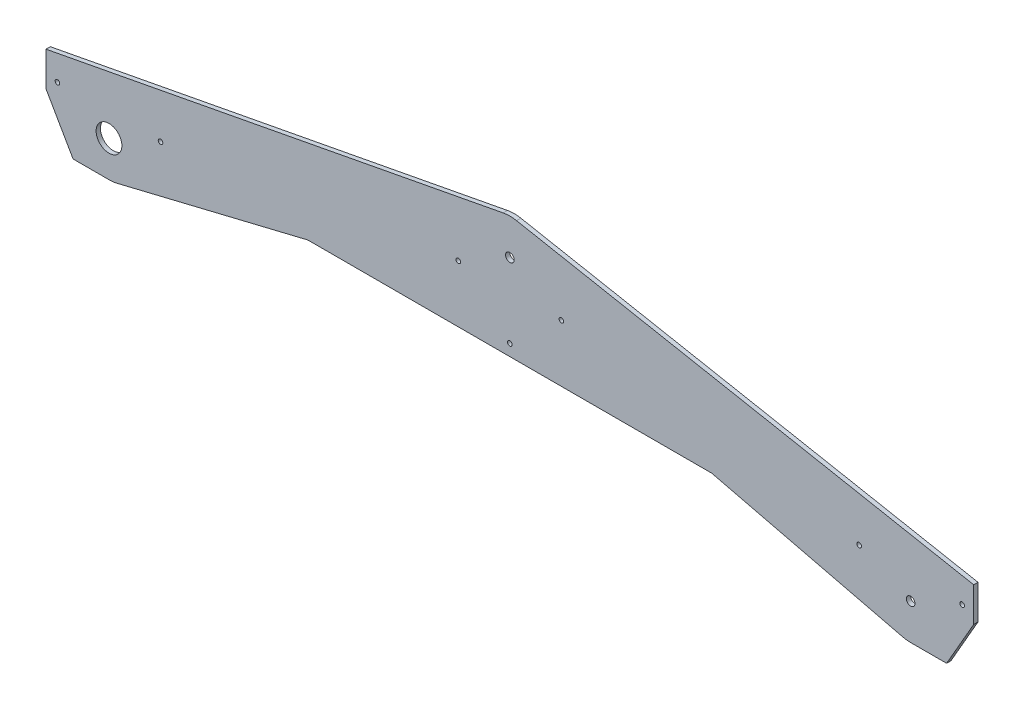
ISO-10303-21;
HEADER;
FILE_DESCRIPTION(('STEP AP214'),'2;1');
FILE_NAME('part.step','',(''),(''),'','','');
FILE_SCHEMA(('AUTOMOTIVE_DESIGN { 1 0 10303 214 1 1 1 1 }'));
ENDSEC;
DATA;
#1=APPLICATION_CONTEXT('core data for automotive mechanical design processes');
#2=APPLICATION_PROTOCOL_DEFINITION('international standard','automotive_design',2000,#1);
#3=PRODUCT_CONTEXT('',#1,'mechanical');
#4=PRODUCT('Part','Part','',(#3));
#5=PRODUCT_RELATED_PRODUCT_CATEGORY('part','',(#4));
#6=PRODUCT_DEFINITION_FORMATION('','',#4);
#7=PRODUCT_DEFINITION_CONTEXT('part definition',#1,'design');
#8=PRODUCT_DEFINITION('design','',#6,#7);
#9=PRODUCT_DEFINITION_SHAPE('','',#8);
#10=(LENGTH_UNIT() NAMED_UNIT(*) SI_UNIT(.MILLI.,.METRE.));
#11=(NAMED_UNIT(*) PLANE_ANGLE_UNIT() SI_UNIT($,.RADIAN.));
#12=(NAMED_UNIT(*) SI_UNIT($,.STERADIAN.) SOLID_ANGLE_UNIT());
#13=UNCERTAINTY_MEASURE_WITH_UNIT(LENGTH_MEASURE(1.E-05),#10,'distance_accuracy_value','');
#14=(GEOMETRIC_REPRESENTATION_CONTEXT(3) GLOBAL_UNCERTAINTY_ASSIGNED_CONTEXT((#13)) GLOBAL_UNIT_ASSIGNED_CONTEXT((#10,
#11,#12)) REPRESENTATION_CONTEXT('',''));
#15=CARTESIAN_POINT('',(0.,0.,0.));
#16=DIRECTION('',(0.,0.,1.));
#17=DIRECTION('',(1.,0.,0.));
#18=AXIS2_PLACEMENT_3D('',#15,#16,#17);
#19=CARTESIAN_POINT('',(369.775537721232,1179.80747292483,4.7752));
#20=DIRECTION('',(0.,0.,1.));
#21=DIRECTION('',(1.,0.,0.));
#22=AXIS2_PLACEMENT_3D('',#19,#20,#21);
#23=PLANE('',#22);
#24=CARTESIAN_POINT('',(312.727138114542,1205.07559249206,4.7752));
#25=DIRECTION('',(0.,0.,1.));
#26=DIRECTION('',(1.,0.,0.));
#27=AXIS2_PLACEMENT_3D('',#24,#25,#26);
#28=CIRCLE('',#27,2.55270000000002);
#29=CARTESIAN_POINT('',(315.279838114542,1205.07559249206,4.7752));
#30=VERTEX_POINT('',#29);
#31=EDGE_CURVE('E571',#30,#30,#28,.T.);
#32=ORIENTED_EDGE('',*,*,#31,.F.);
#33=EDGE_LOOP('',(#32));
#34=FACE_BOUND('',#33,.T.);
#35=CARTESIAN_POINT('',(871.524986723314,1255.87559249206,4.7752));
#36=DIRECTION('',(0.,0.,1.));
#37=DIRECTION('',(1.,0.,0.));
#38=AXIS2_PLACEMENT_3D('',#35,#36,#37);
#39=CIRCLE('',#38,2.55269999999996);
#40=CARTESIAN_POINT('',(874.077686723314,1255.87559249206,4.7752));
#41=VERTEX_POINT('',#40);
#42=EDGE_CURVE('E559',#41,#41,#39,.T.);
#43=ORIENTED_EDGE('',*,*,#42,.F.);
#44=EDGE_LOOP('',(#43));
#45=FACE_BOUND('',#44,.T.);
#46=CARTESIAN_POINT('',(1316.02498672331,1205.07559249206,4.7752));
#47=DIRECTION('',(0.,0.,1.));
#48=DIRECTION('',(1.,0.,0.));
#49=AXIS2_PLACEMENT_3D('',#46,#47,#48);
#50=CIRCLE('',#49,2.55270000000007);
#51=CARTESIAN_POINT('',(1318.57768672331,1205.07559249206,4.7752));
#52=VERTEX_POINT('',#51);
#53=EDGE_CURVE('E547',#52,#52,#50,.T.);
#54=ORIENTED_EDGE('',*,*,#53,.F.);
#55=EDGE_LOOP('',(#54));
#56=FACE_BOUND('',#55,.T.);
#57=CARTESIAN_POINT('',(1258.87498711663,1179.80747292483,4.7752));
#58=DIRECTION('',(0.,0.,1.));
#59=DIRECTION('',(1.,0.,0.));
#60=AXIS2_PLACEMENT_3D('',#57,#58,#59);
#61=CIRCLE('',#60,4.7625);
#62=CARTESIAN_POINT('',(1263.63748711663,1179.80747292483,4.7752));
#63=VERTEX_POINT('',#62);
#64=EDGE_CURVE('E535',#63,#63,#61,.T.);
#65=ORIENTED_EDGE('',*,*,#64,.F.);
#66=EDGE_LOOP('',(#65));
#67=FACE_BOUND('',#66,.T.);
#68=CARTESIAN_POINT('',(369.877137721231,1179.80747292483,4.7752));
#69=DIRECTION('',(0.,0.,1.));
#70=DIRECTION('',(1.,0.,0.));
#71=AXIS2_PLACEMENT_3D('',#68,#69,#70);
#72=CIRCLE('',#71,14.2875);
#73=CARTESIAN_POINT('',(384.164637721231,1179.80747292483,4.7752));
#74=VERTEX_POINT('',#73);
#75=EDGE_CURVE('E173',#74,#74,#72,.T.);
#76=ORIENTED_EDGE('',*,*,#75,.F.);
#77=EDGE_LOOP('',(#76));
#78=FACE_BOUND('',#77,.T.);
#79=CARTESIAN_POINT('',(369.775537721232,1179.80747292483,4.7752));
#80=DIRECTION('',(0.,0.,1.));
#81=DIRECTION('',(1.,0.,0.));
#82=AXIS2_PLACEMENT_3D('',#79,#80,#81);
#83=CIRCLE('',#82,39.7764);
#84=CARTESIAN_POINT('',(369.775537721231,1140.03107292483,4.7752));
#85=VERTEX_POINT('',#84);
#86=CARTESIAN_POINT('',(379.149829151737,1141.15149464028,4.7752));
#87=VERTEX_POINT('',#86);
#88=EDGE_CURVE('E197',#85,#87,#83,.T.);
#89=ORIENTED_EDGE('',*,*,#88,.T.);
#90=DIRECTION('',(0.971831997982581,0.235674707376892,0.));
#91=VECTOR('',#90,1.);
#92=CARTESIAN_POINT('',(379.149829151737,1141.15149464028,4.7752));
#93=LINE('',#92,#91);
#94=CARTESIAN_POINT('',(590.378339475251,1192.37559249206,4.7752));
#95=VERTEX_POINT('',#94);
#96=EDGE_CURVE('E114',#87,#95,#93,.T.);
#97=ORIENTED_EDGE('',*,*,#96,.T.);
#98=DIRECTION('',(1.,0.,0.));
#99=VECTOR('',#98,1.);
#100=CARTESIAN_POINT('',(590.378339475251,1192.37559249206,4.7752));
#101=LINE('',#100,#99);
#102=CARTESIAN_POINT('',(1038.3737853626,1192.37559249206,4.7752));
#103=VERTEX_POINT('',#102);
#104=EDGE_CURVE('E229',#95,#103,#101,.T.);
#105=ORIENTED_EDGE('',*,*,#104,.T.);
#106=DIRECTION('',(0.971831997982581,-0.235674707376892,0.));
#107=VECTOR('',#106,1.);
#108=CARTESIAN_POINT('',(1249.60229568612,1141.15149464028,4.7752));
#109=LINE('',#108,#107);
#110=CARTESIAN_POINT('',(1249.60229568612,1141.15149464028,4.7752));
#111=VERTEX_POINT('',#110);
#112=EDGE_CURVE('E250',#103,#111,#109,.T.);
#113=ORIENTED_EDGE('',*,*,#112,.T.);
#114=CARTESIAN_POINT('',(1258.97658711662,1179.80747292483,4.7752));
#115=DIRECTION('',(0.,0.,1.));
#116=DIRECTION('',(1.,0.,0.));
#117=AXIS2_PLACEMENT_3D('',#114,#115,#116);
#118=CIRCLE('',#117,39.7764);
#119=CARTESIAN_POINT('',(1258.97658711663,1140.03107292483,4.7752));
#120=VERTEX_POINT('',#119);
#121=EDGE_CURVE('E247',#111,#120,#118,.T.);
#122=ORIENTED_EDGE('',*,*,#121,.T.);
#123=DIRECTION('',(1.,0.,0.));
#124=VECTOR('',#123,1.);
#125=CARTESIAN_POINT('',(1258.97658711663,1140.03107292483,4.7752));
#126=LINE('',#125,#124);
#127=CARTESIAN_POINT('',(1298.69630744632,1140.03107292483,4.7752));
#128=VERTEX_POINT('',#127);
#129=EDGE_CURVE('E249',#120,#128,#126,.T.);
#130=ORIENTED_EDGE('',*,*,#129,.T.);
#131=DIRECTION('',(0.497619767259015,0.867395277386892,0.));
#132=VECTOR('',#131,1.);
#133=CARTESIAN_POINT('',(1328.72606241893,1192.37559249206,4.7752));
#134=LINE('',#133,#132);
#135=CARTESIAN_POINT('',(1328.72606241893,1192.37559249206,4.7752));
#136=VERTEX_POINT('',#135);
#137=EDGE_CURVE('E252',#128,#136,#134,.T.);
#138=ORIENTED_EDGE('',*,*,#137,.T.);
#139=DIRECTION('',(0.,1.,0.));
#140=VECTOR('',#139,1.);
#141=CARTESIAN_POINT('',(1328.72606241893,1230.47559249206,4.7752));
#142=LINE('',#141,#140);
#143=CARTESIAN_POINT('',(1328.72606241893,1230.47559249206,4.7752));
#144=VERTEX_POINT('',#143);
#145=EDGE_CURVE('E258',#136,#144,#142,.T.);
#146=ORIENTED_EDGE('',*,*,#145,.T.);
#147=DIRECTION('',(-0.982455891143731,0.18649509901597,0.));
#148=VECTOR('',#147,1.);
#149=CARTESIAN_POINT('',(1328.72606241893,1230.47559249206,4.7752));
#150=LINE('',#149,#148);
#151=CARTESIAN_POINT('',(821.794166075427,1326.70415100055,4.7752));
#152=VERTEX_POINT('',#151);
#153=EDGE_CURVE('E260',#144,#152,#150,.T.);
#154=ORIENTED_EDGE('',*,*,#153,.T.);
#155=CARTESIAN_POINT('',(814.376062418928,1287.62559249206,4.7752));
#156=DIRECTION('',(0.,0.,1.));
#157=DIRECTION('',(1.,0.,0.));
#158=AXIS2_PLACEMENT_3D('',#155,#156,#157);
#159=CIRCLE('',#158,39.7764000000001);
#160=CARTESIAN_POINT('',(806.957958762429,1326.70415100055,4.7752));
#161=VERTEX_POINT('',#160);
#162=EDGE_CURVE('E262',#152,#161,#159,.T.);
#163=ORIENTED_EDGE('',*,*,#162,.T.);
#164=DIRECTION('',(-0.982455891143731,-0.18649509901597,0.));
#165=VECTOR('',#164,1.);
#166=CARTESIAN_POINT('',(300.026062418928,1230.47559249206,4.7752));
#167=LINE('',#166,#165);
#168=CARTESIAN_POINT('',(300.026062418928,1230.47559249206,4.7752));
#169=VERTEX_POINT('',#168);
#170=EDGE_CURVE('E151',#161,#169,#167,.T.);
#171=ORIENTED_EDGE('',*,*,#170,.T.);
#172=DIRECTION('',(0.,-1.,0.));
#173=VECTOR('',#172,1.);
#174=CARTESIAN_POINT('',(300.026062418928,1230.47559249206,4.7752));
#175=LINE('',#174,#173);
#176=CARTESIAN_POINT('',(300.026062418928,1192.37559249206,4.7752));
#177=VERTEX_POINT('',#176);
#178=EDGE_CURVE('E145',#169,#177,#175,.T.);
#179=ORIENTED_EDGE('',*,*,#178,.T.);
#180=DIRECTION('',(0.497619767259015,-0.867395277386893,0.));
#181=VECTOR('',#180,1.);
#182=CARTESIAN_POINT('',(300.026062418928,1192.37559249206,4.7752));
#183=LINE('',#182,#181);
#184=CARTESIAN_POINT('',(330.055817391538,1140.03107292483,4.7752));
#185=VERTEX_POINT('',#184);
#186=EDGE_CURVE('E149',#177,#185,#183,.T.);
#187=ORIENTED_EDGE('',*,*,#186,.T.);
#188=DIRECTION('',(1.,0.,0.));
#189=VECTOR('',#188,1.);
#190=CARTESIAN_POINT('',(369.775537721231,1140.03107292483,4.7752));
#191=LINE('',#190,#189);
#192=EDGE_CURVE('E53',#185,#85,#191,.T.);
#193=ORIENTED_EDGE('',*,*,#192,.T.);
#194=EDGE_LOOP('',(#89,#97,#105,#113,#122,#130,#138,#146,#154,#163,#171,#179,#187,#193));
#195=FACE_BOUND('',#194,.T.);
#196=CARTESIAN_POINT('',(814.376062418928,1287.62559249206,4.7752));
#197=DIRECTION('',(0.,0.,1.));
#198=DIRECTION('',(1.,0.,0.));
#199=AXIS2_PLACEMENT_3D('',#196,#197,#198);
#200=CIRCLE('',#199,4.76250000000011);
#201=CARTESIAN_POINT('',(819.138562418928,1287.62559249206,4.7752));
#202=VERTEX_POINT('',#201);
#203=EDGE_CURVE('E529',#202,#202,#200,.T.);
#204=ORIENTED_EDGE('',*,*,#203,.F.);
#205=EDGE_LOOP('',(#204));
#206=FACE_BOUND('',#205,.T.);
#207=CARTESIAN_POINT('',(1201.72498750994,1205.07559249206,4.7752));
#208=DIRECTION('',(0.,0.,1.));
#209=DIRECTION('',(1.,0.,0.));
#210=AXIS2_PLACEMENT_3D('',#207,#208,#209);
#211=CIRCLE('',#210,2.55270000000007);
#212=CARTESIAN_POINT('',(1204.27768750994,1205.07559249206,4.7752));
#213=VERTEX_POINT('',#212);
#214=EDGE_CURVE('E541',#213,#213,#211,.T.);
#215=ORIENTED_EDGE('',*,*,#214,.F.);
#216=EDGE_LOOP('',(#215));
#217=FACE_BOUND('',#216,.T.);
#218=CARTESIAN_POINT('',(757.227138114542,1255.87559249206,4.7752));
#219=DIRECTION('',(0.,0.,1.));
#220=DIRECTION('',(1.,0.,0.));
#221=AXIS2_PLACEMENT_3D('',#218,#219,#220);
#222=CIRCLE('',#221,2.55269999999996);
#223=CARTESIAN_POINT('',(759.779838114542,1255.87559249206,4.7752));
#224=VERTEX_POINT('',#223);
#225=EDGE_CURVE('E553',#224,#224,#222,.T.);
#226=ORIENTED_EDGE('',*,*,#225,.F.);
#227=EDGE_LOOP('',(#226));
#228=FACE_BOUND('',#227,.T.);
#229=CARTESIAN_POINT('',(814.376062418928,1205.07559249206,4.7752));
#230=DIRECTION('',(0.,0.,1.));
#231=DIRECTION('',(1.,0.,0.));
#232=AXIS2_PLACEMENT_3D('',#229,#230,#231);
#233=CIRCLE('',#232,2.55269999999996);
#234=CARTESIAN_POINT('',(816.928762418928,1205.07559249206,4.7752));
#235=VERTEX_POINT('',#234);
#236=EDGE_CURVE('E565',#235,#235,#233,.T.);
#237=ORIENTED_EDGE('',*,*,#236,.F.);
#238=EDGE_LOOP('',(#237));
#239=FACE_BOUND('',#238,.T.);
#240=CARTESIAN_POINT('',(427.027137327919,1205.07559249206,4.7752));
#241=DIRECTION('',(0.,0.,1.));
#242=DIRECTION('',(1.,0.,0.));
#243=AXIS2_PLACEMENT_3D('',#240,#241,#242);
#244=CIRCLE('',#243,2.55270000000002);
#245=CARTESIAN_POINT('',(429.579837327919,1205.07559249206,4.7752));
#246=VERTEX_POINT('',#245);
#247=EDGE_CURVE('E577',#246,#246,#244,.T.);
#248=ORIENTED_EDGE('',*,*,#247,.F.);
#249=EDGE_LOOP('',(#248));
#250=FACE_BOUND('',#249,.T.);
#251=ADVANCED_FACE('F36',(#34,#45,#56,#67,#78,#195,#206,#217,#228,#239,#250),#23,.T.);
#252=CARTESIAN_POINT('',(369.775537721232,1179.80747292483,0.));
#253=DIRECTION('',(0.,0.,1.));
#254=DIRECTION('',(1.,0.,0.));
#255=AXIS2_PLACEMENT_3D('',#252,#253,#254);
#256=PLANE('',#255);
#257=CARTESIAN_POINT('',(312.727138114542,1205.07559249206,0.));
#258=DIRECTION('',(0.,0.,1.));
#259=DIRECTION('',(1.,0.,0.));
#260=AXIS2_PLACEMENT_3D('',#257,#258,#259);
#261=CIRCLE('',#260,2.55270000000002);
#262=CARTESIAN_POINT('',(315.279838114542,1205.07559249206,0.));
#263=VERTEX_POINT('',#262);
#264=EDGE_CURVE('E574',#263,#263,#261,.T.);
#265=ORIENTED_EDGE('',*,*,#264,.T.);
#266=EDGE_LOOP('',(#265));
#267=FACE_BOUND('',#266,.T.);
#268=CARTESIAN_POINT('',(871.524986723314,1255.87559249206,0.));
#269=DIRECTION('',(0.,0.,1.));
#270=DIRECTION('',(1.,0.,0.));
#271=AXIS2_PLACEMENT_3D('',#268,#269,#270);
#272=CIRCLE('',#271,2.55269999999996);
#273=CARTESIAN_POINT('',(874.077686723314,1255.87559249206,0.));
#274=VERTEX_POINT('',#273);
#275=EDGE_CURVE('E562',#274,#274,#272,.T.);
#276=ORIENTED_EDGE('',*,*,#275,.T.);
#277=EDGE_LOOP('',(#276));
#278=FACE_BOUND('',#277,.T.);
#279=CARTESIAN_POINT('',(1316.02498672331,1205.07559249206,0.));
#280=DIRECTION('',(0.,0.,1.));
#281=DIRECTION('',(1.,0.,0.));
#282=AXIS2_PLACEMENT_3D('',#279,#280,#281);
#283=CIRCLE('',#282,2.55270000000007);
#284=CARTESIAN_POINT('',(1318.57768672331,1205.07559249206,0.));
#285=VERTEX_POINT('',#284);
#286=EDGE_CURVE('E550',#285,#285,#283,.T.);
#287=ORIENTED_EDGE('',*,*,#286,.T.);
#288=EDGE_LOOP('',(#287));
#289=FACE_BOUND('',#288,.T.);
#290=CARTESIAN_POINT('',(1258.87498711663,1179.80747292483,0.));
#291=DIRECTION('',(0.,0.,1.));
#292=DIRECTION('',(1.,0.,0.));
#293=AXIS2_PLACEMENT_3D('',#290,#291,#292);
#294=CIRCLE('',#293,4.7625);
#295=CARTESIAN_POINT('',(1263.63748711663,1179.80747292483,0.));
#296=VERTEX_POINT('',#295);
#297=EDGE_CURVE('E538',#296,#296,#294,.T.);
#298=ORIENTED_EDGE('',*,*,#297,.T.);
#299=EDGE_LOOP('',(#298));
#300=FACE_BOUND('',#299,.T.);
#301=CARTESIAN_POINT('',(369.877137721231,1179.80747292483,0.));
#302=DIRECTION('',(0.,0.,1.));
#303=DIRECTION('',(1.,0.,0.));
#304=AXIS2_PLACEMENT_3D('',#301,#302,#303);
#305=CIRCLE('',#304,14.2875);
#306=CARTESIAN_POINT('',(384.164637721231,1179.80747292483,0.));
#307=VERTEX_POINT('',#306);
#308=EDGE_CURVE('E526',#307,#307,#305,.T.);
#309=ORIENTED_EDGE('',*,*,#308,.T.);
#310=EDGE_LOOP('',(#309));
#311=FACE_BOUND('',#310,.T.);
#312=CARTESIAN_POINT('',(369.775537721232,1179.80747292483,0.));
#313=DIRECTION('',(0.,0.,1.));
#314=DIRECTION('',(1.,0.,0.));
#315=AXIS2_PLACEMENT_3D('',#312,#313,#314);
#316=CIRCLE('',#315,39.7764);
#317=CARTESIAN_POINT('',(369.775537721231,1140.03107292483,0.));
#318=VERTEX_POINT('',#317);
#319=CARTESIAN_POINT('',(379.149829151737,1141.15149464028,0.));
#320=VERTEX_POINT('',#319);
#321=EDGE_CURVE('E169',#318,#320,#316,.T.);
#322=ORIENTED_EDGE('',*,*,#321,.F.);
#323=DIRECTION('',(1.,0.,0.));
#324=VECTOR('',#323,1.);
#325=CARTESIAN_POINT('',(369.775537721231,1140.03107292483,0.));
#326=LINE('',#325,#324);
#327=CARTESIAN_POINT('',(330.055817391538,1140.03107292483,0.));
#328=VERTEX_POINT('',#327);
#329=EDGE_CURVE('E106',#328,#318,#326,.T.);
#330=ORIENTED_EDGE('',*,*,#329,.F.);
#331=DIRECTION('',(0.497619767259015,-0.867395277386893,0.));
#332=VECTOR('',#331,1.);
#333=CARTESIAN_POINT('',(300.026062418928,1192.37559249206,0.));
#334=LINE('',#333,#332);
#335=CARTESIAN_POINT('',(300.026062418928,1192.37559249206,0.));
#336=VERTEX_POINT('',#335);
#337=EDGE_CURVE('E100',#336,#328,#334,.T.);
#338=ORIENTED_EDGE('',*,*,#337,.F.);
#339=DIRECTION('',(0.,-1.,0.));
#340=VECTOR('',#339,1.);
#341=CARTESIAN_POINT('',(300.026062418928,1230.47559249206,0.));
#342=LINE('',#341,#340);
#343=CARTESIAN_POINT('',(300.026062418928,1230.47559249206,0.));
#344=VERTEX_POINT('',#343);
#345=EDGE_CURVE('E159',#344,#336,#342,.T.);
#346=ORIENTED_EDGE('',*,*,#345,.F.);
#347=DIRECTION('',(-0.982455891143731,-0.18649509901597,0.));
#348=VECTOR('',#347,1.);
#349=CARTESIAN_POINT('',(300.026062418928,1230.47559249206,0.));
#350=LINE('',#349,#348);
#351=CARTESIAN_POINT('',(806.957958762429,1326.70415100055,0.));
#352=VERTEX_POINT('',#351);
#353=EDGE_CURVE('E192',#352,#344,#350,.T.);
#354=ORIENTED_EDGE('',*,*,#353,.F.);
#355=CARTESIAN_POINT('',(814.376062418928,1287.62559249206,0.));
#356=DIRECTION('',(0.,0.,1.));
#357=DIRECTION('',(1.,0.,0.));
#358=AXIS2_PLACEMENT_3D('',#355,#356,#357);
#359=CIRCLE('',#358,39.7764000000001);
#360=CARTESIAN_POINT('',(821.794166075427,1326.70415100055,0.));
#361=VERTEX_POINT('',#360);
#362=EDGE_CURVE('E190',#361,#352,#359,.T.);
#363=ORIENTED_EDGE('',*,*,#362,.F.);
#364=DIRECTION('',(-0.982455891143731,0.18649509901597,0.));
#365=VECTOR('',#364,1.);
#366=CARTESIAN_POINT('',(1328.72606241893,1230.47559249206,0.));
#367=LINE('',#366,#365);
#368=CARTESIAN_POINT('',(1328.72606241893,1230.47559249206,0.));
#369=VERTEX_POINT('',#368);
#370=EDGE_CURVE('E188',#369,#361,#367,.T.);
#371=ORIENTED_EDGE('',*,*,#370,.F.);
#372=DIRECTION('',(0.,1.,0.));
#373=VECTOR('',#372,1.);
#374=CARTESIAN_POINT('',(1328.72606241893,1230.47559249206,0.));
#375=LINE('',#374,#373);
#376=CARTESIAN_POINT('',(1328.72606241893,1192.37559249206,0.));
#377=VERTEX_POINT('',#376);
#378=EDGE_CURVE('E186',#377,#369,#375,.T.);
#379=ORIENTED_EDGE('',*,*,#378,.F.);
#380=DIRECTION('',(0.497619767259015,0.867395277386892,0.));
#381=VECTOR('',#380,1.);
#382=CARTESIAN_POINT('',(1328.72606241893,1192.37559249206,0.));
#383=LINE('',#382,#381);
#384=CARTESIAN_POINT('',(1298.69630744632,1140.03107292483,0.));
#385=VERTEX_POINT('',#384);
#386=EDGE_CURVE('E184',#385,#377,#383,.T.);
#387=ORIENTED_EDGE('',*,*,#386,.F.);
#388=DIRECTION('',(1.,0.,0.));
#389=VECTOR('',#388,1.);
#390=CARTESIAN_POINT('',(1258.97658711663,1140.03107292483,0.));
#391=LINE('',#390,#389);
#392=CARTESIAN_POINT('',(1258.97658711663,1140.03107292483,0.));
#393=VERTEX_POINT('',#392);
#394=EDGE_CURVE('E182',#393,#385,#391,.T.);
#395=ORIENTED_EDGE('',*,*,#394,.F.);
#396=CARTESIAN_POINT('',(1258.97658711662,1179.80747292483,0.));
#397=DIRECTION('',(0.,0.,1.));
#398=DIRECTION('',(1.,0.,0.));
#399=AXIS2_PLACEMENT_3D('',#396,#397,#398);
#400=CIRCLE('',#399,39.7764);
#401=CARTESIAN_POINT('',(1249.60229568612,1141.15149464028,0.));
#402=VERTEX_POINT('',#401);
#403=EDGE_CURVE('E180',#402,#393,#400,.T.);
#404=ORIENTED_EDGE('',*,*,#403,.F.);
#405=DIRECTION('',(0.971831997982581,-0.235674707376892,0.));
#406=VECTOR('',#405,1.);
#407=CARTESIAN_POINT('',(1249.60229568612,1141.15149464028,0.));
#408=LINE('',#407,#406);
#409=CARTESIAN_POINT('',(1038.3737853626,1192.37559249206,0.));
#410=VERTEX_POINT('',#409);
#411=EDGE_CURVE('E178',#410,#402,#408,.T.);
#412=ORIENTED_EDGE('',*,*,#411,.F.);
#413=DIRECTION('',(1.,0.,0.));
#414=VECTOR('',#413,1.);
#415=CARTESIAN_POINT('',(1038.3737853626,1192.37559249206,0.));
#416=LINE('',#415,#414);
#417=CARTESIAN_POINT('',(590.378339475251,1192.37559249206,0.));
#418=VERTEX_POINT('',#417);
#419=EDGE_CURVE('E176',#418,#410,#416,.T.);
#420=ORIENTED_EDGE('',*,*,#419,.F.);
#421=DIRECTION('',(0.971831997982581,0.235674707376892,0.));
#422=VECTOR('',#421,1.);
#423=CARTESIAN_POINT('',(379.149829151737,1141.15149464028,0.));
#424=LINE('',#423,#422);
#425=EDGE_CURVE('E172',#320,#418,#424,.T.);
#426=ORIENTED_EDGE('',*,*,#425,.F.);
#427=EDGE_LOOP('',(#322,#330,#338,#346,#354,#363,#371,#379,#387,#395,#404,#412,#420,#426));
#428=FACE_BOUND('',#427,.T.);
#429=CARTESIAN_POINT('',(814.376062418928,1287.62559249206,0.));
#430=DIRECTION('',(0.,0.,1.));
#431=DIRECTION('',(1.,0.,0.));
#432=AXIS2_PLACEMENT_3D('',#429,#430,#431);
#433=CIRCLE('',#432,4.76250000000011);
#434=CARTESIAN_POINT('',(819.138562418928,1287.62559249206,0.));
#435=VERTEX_POINT('',#434);
#436=EDGE_CURVE('E532',#435,#435,#433,.T.);
#437=ORIENTED_EDGE('',*,*,#436,.T.);
#438=EDGE_LOOP('',(#437));
#439=FACE_BOUND('',#438,.T.);
#440=CARTESIAN_POINT('',(1201.72498750994,1205.07559249206,0.));
#441=DIRECTION('',(0.,0.,1.));
#442=DIRECTION('',(1.,0.,0.));
#443=AXIS2_PLACEMENT_3D('',#440,#441,#442);
#444=CIRCLE('',#443,2.55270000000007);
#445=CARTESIAN_POINT('',(1204.27768750994,1205.07559249206,0.));
#446=VERTEX_POINT('',#445);
#447=EDGE_CURVE('E544',#446,#446,#444,.T.);
#448=ORIENTED_EDGE('',*,*,#447,.T.);
#449=EDGE_LOOP('',(#448));
#450=FACE_BOUND('',#449,.T.);
#451=CARTESIAN_POINT('',(757.227138114542,1255.87559249206,0.));
#452=DIRECTION('',(0.,0.,1.));
#453=DIRECTION('',(1.,0.,0.));
#454=AXIS2_PLACEMENT_3D('',#451,#452,#453);
#455=CIRCLE('',#454,2.55269999999996);
#456=CARTESIAN_POINT('',(759.779838114542,1255.87559249206,0.));
#457=VERTEX_POINT('',#456);
#458=EDGE_CURVE('E556',#457,#457,#455,.T.);
#459=ORIENTED_EDGE('',*,*,#458,.T.);
#460=EDGE_LOOP('',(#459));
#461=FACE_BOUND('',#460,.T.);
#462=CARTESIAN_POINT('',(814.376062418928,1205.07559249206,0.));
#463=DIRECTION('',(0.,0.,1.));
#464=DIRECTION('',(1.,0.,0.));
#465=AXIS2_PLACEMENT_3D('',#462,#463,#464);
#466=CIRCLE('',#465,2.55269999999996);
#467=CARTESIAN_POINT('',(816.928762418928,1205.07559249206,0.));
#468=VERTEX_POINT('',#467);
#469=EDGE_CURVE('E568',#468,#468,#466,.T.);
#470=ORIENTED_EDGE('',*,*,#469,.T.);
#471=EDGE_LOOP('',(#470));
#472=FACE_BOUND('',#471,.T.);
#473=CARTESIAN_POINT('',(427.027137327919,1205.07559249206,0.));
#474=DIRECTION('',(0.,0.,1.));
#475=DIRECTION('',(1.,0.,0.));
#476=AXIS2_PLACEMENT_3D('',#473,#474,#475);
#477=CIRCLE('',#476,2.55270000000002);
#478=CARTESIAN_POINT('',(429.579837327919,1205.07559249206,0.));
#479=VERTEX_POINT('',#478);
#480=EDGE_CURVE('E580',#479,#479,#477,.T.);
#481=ORIENTED_EDGE('',*,*,#480,.T.);
#482=EDGE_LOOP('',(#481));
#483=FACE_BOUND('',#482,.T.);
#484=ADVANCED_FACE('F234',(#267,#278,#289,#300,#311,#428,#439,#450,#461,#472,#483),#256,.F.);
#485=CARTESIAN_POINT('',(369.775537721232,1179.80747292483,4.7752));
#486=DIRECTION('',(0.,0.,-1.));
#487=DIRECTION('',(-1.,0.,0.));
#488=AXIS2_PLACEMENT_3D('',#485,#486,#487);
#489=CYLINDRICAL_SURFACE('',#488,39.7764);
#490=ORIENTED_EDGE('',*,*,#321,.T.);
#491=DIRECTION('',(0.,0.,-1.));
#492=VECTOR('',#491,1.);
#493=CARTESIAN_POINT('',(379.149829151737,1141.15149464028,4.7752));
#494=LINE('',#493,#492);
#495=EDGE_CURVE('E11',#87,#320,#494,.T.);
#496=ORIENTED_EDGE('',*,*,#495,.F.);
#497=ORIENTED_EDGE('',*,*,#88,.F.);
#498=DIRECTION('',(0.,0.,-1.));
#499=VECTOR('',#498,1.);
#500=CARTESIAN_POINT('',(369.775537721231,1140.03107292483,4.7752));
#501=LINE('',#500,#499);
#502=EDGE_CURVE('E165',#85,#318,#501,.T.);
#503=ORIENTED_EDGE('',*,*,#502,.T.);
#504=EDGE_LOOP('',(#490,#496,#497,#503));
#505=FACE_BOUND('',#504,.T.);
#506=ADVANCED_FACE('F38',(#505),#489,.T.);
#507=CARTESIAN_POINT('',(379.149829151737,1141.15149464028,4.7752));
#508=DIRECTION('',(-0.235674707376892,0.971831997982582,0.));
#509=DIRECTION('',(-0.971831997982582,-0.235674707376892,0.));
#510=AXIS2_PLACEMENT_3D('',#507,#508,#509);
#511=PLANE('',#510);
#512=ORIENTED_EDGE('',*,*,#425,.T.);
#513=DIRECTION('',(0.,0.,-1.));
#514=VECTOR('',#513,1.);
#515=CARTESIAN_POINT('',(590.378339475251,1192.37559249206,4.7752));
#516=LINE('',#515,#514);
#517=EDGE_CURVE('E45',#95,#418,#516,.T.);
#518=ORIENTED_EDGE('',*,*,#517,.F.);
#519=ORIENTED_EDGE('',*,*,#96,.F.);
#520=ORIENTED_EDGE('',*,*,#495,.T.);
#521=EDGE_LOOP('',(#512,#518,#519,#520));
#522=FACE_BOUND('',#521,.T.);
#523=ADVANCED_FACE('F230',(#522),#511,.F.);
#524=CARTESIAN_POINT('',(1038.3737853626,1192.37559249206,4.7752));
#525=DIRECTION('',(0.,1.,0.));
#526=DIRECTION('',(0.,0.,1.));
#527=AXIS2_PLACEMENT_3D('',#524,#525,#526);
#528=PLANE('',#527);
#529=ORIENTED_EDGE('',*,*,#419,.T.);
#530=DIRECTION('',(0.,0.,-1.));
#531=VECTOR('',#530,1.);
#532=CARTESIAN_POINT('',(1038.3737853626,1192.37559249206,4.7752));
#533=LINE('',#532,#531);
#534=EDGE_CURVE('E222',#103,#410,#533,.T.);
#535=ORIENTED_EDGE('',*,*,#534,.F.);
#536=ORIENTED_EDGE('',*,*,#104,.F.);
#537=ORIENTED_EDGE('',*,*,#517,.T.);
#538=EDGE_LOOP('',(#529,#535,#536,#537));
#539=FACE_BOUND('',#538,.T.);
#540=ADVANCED_FACE('F227',(#539),#528,.F.);
#541=CARTESIAN_POINT('',(1249.60229568612,1141.15149464028,4.7752));
#542=DIRECTION('',(0.235674707376892,0.971831997982582,0.));
#543=DIRECTION('',(-0.971831997982582,0.235674707376892,0.));
#544=AXIS2_PLACEMENT_3D('',#541,#542,#543);
#545=PLANE('',#544);
#546=ORIENTED_EDGE('',*,*,#411,.T.);
#547=DIRECTION('',(0.,0.,-1.));
#548=VECTOR('',#547,1.);
#549=CARTESIAN_POINT('',(1249.60229568612,1141.15149464028,4.7752));
#550=LINE('',#549,#548);
#551=EDGE_CURVE('E219',#111,#402,#550,.T.);
#552=ORIENTED_EDGE('',*,*,#551,.F.);
#553=ORIENTED_EDGE('',*,*,#112,.F.);
#554=ORIENTED_EDGE('',*,*,#534,.T.);
#555=EDGE_LOOP('',(#546,#552,#553,#554));
#556=FACE_BOUND('',#555,.T.);
#557=ADVANCED_FACE('F241',(#556),#545,.F.);
#558=CARTESIAN_POINT('',(1258.97658711662,1179.80747292483,4.7752));
#559=DIRECTION('',(0.,0.,-1.));
#560=DIRECTION('',(-1.,0.,0.));
#561=AXIS2_PLACEMENT_3D('',#558,#559,#560);
#562=CYLINDRICAL_SURFACE('',#561,39.7764);
#563=ORIENTED_EDGE('',*,*,#403,.T.);
#564=DIRECTION('',(0.,0.,-1.));
#565=VECTOR('',#564,1.);
#566=CARTESIAN_POINT('',(1258.97658711663,1140.03107292483,4.7752));
#567=LINE('',#566,#565);
#568=EDGE_CURVE('E216',#120,#393,#567,.T.);
#569=ORIENTED_EDGE('',*,*,#568,.F.);
#570=ORIENTED_EDGE('',*,*,#121,.F.);
#571=ORIENTED_EDGE('',*,*,#551,.T.);
#572=EDGE_LOOP('',(#563,#569,#570,#571));
#573=FACE_BOUND('',#572,.T.);
#574=ADVANCED_FACE('F245',(#573),#562,.T.);
#575=CARTESIAN_POINT('',(1258.97658711663,1140.03107292483,4.7752));
#576=DIRECTION('',(0.,1.,0.));
#577=DIRECTION('',(0.,0.,1.));
#578=AXIS2_PLACEMENT_3D('',#575,#576,#577);
#579=PLANE('',#578);
#580=ORIENTED_EDGE('',*,*,#394,.T.);
#581=DIRECTION('',(0.,0.,-1.));
#582=VECTOR('',#581,1.);
#583=CARTESIAN_POINT('',(1298.69630744632,1140.03107292483,4.7752));
#584=LINE('',#583,#582);
#585=EDGE_CURVE('E213',#128,#385,#584,.T.);
#586=ORIENTED_EDGE('',*,*,#585,.F.);
#587=ORIENTED_EDGE('',*,*,#129,.F.);
#588=ORIENTED_EDGE('',*,*,#568,.T.);
#589=EDGE_LOOP('',(#580,#586,#587,#588));
#590=FACE_BOUND('',#589,.T.);
#591=ADVANCED_FACE('F288',(#590),#579,.F.);
#592=CARTESIAN_POINT('',(1328.72606241893,1192.37559249206,4.7752));
#593=DIRECTION('',(-0.867395277386892,0.497619767259015,0.));
#594=DIRECTION('',(-0.497619767259015,-0.867395277386892,0.));
#595=AXIS2_PLACEMENT_3D('',#592,#593,#594);
#596=PLANE('',#595);
#597=ORIENTED_EDGE('',*,*,#386,.T.);
#598=DIRECTION('',(0.,0.,-1.));
#599=VECTOR('',#598,1.);
#600=CARTESIAN_POINT('',(1328.72606241893,1192.37559249206,4.7752));
#601=LINE('',#600,#599);
#602=EDGE_CURVE('E210',#136,#377,#601,.T.);
#603=ORIENTED_EDGE('',*,*,#602,.F.);
#604=ORIENTED_EDGE('',*,*,#137,.F.);
#605=ORIENTED_EDGE('',*,*,#585,.T.);
#606=EDGE_LOOP('',(#597,#603,#604,#605));
#607=FACE_BOUND('',#606,.T.);
#608=ADVANCED_FACE('F285',(#607),#596,.F.);
#609=CARTESIAN_POINT('',(1328.72606241893,1230.47559249206,4.7752));
#610=DIRECTION('',(-1.,0.,0.));
#611=DIRECTION('',(0.,0.,1.));
#612=AXIS2_PLACEMENT_3D('',#609,#610,#611);
#613=PLANE('',#612);
#614=ORIENTED_EDGE('',*,*,#378,.T.);
#615=DIRECTION('',(0.,0.,-1.));
#616=VECTOR('',#615,1.);
#617=CARTESIAN_POINT('',(1328.72606241893,1230.47559249206,4.7752));
#618=LINE('',#617,#616);
#619=EDGE_CURVE('E207',#144,#369,#618,.T.);
#620=ORIENTED_EDGE('',*,*,#619,.F.);
#621=ORIENTED_EDGE('',*,*,#145,.F.);
#622=ORIENTED_EDGE('',*,*,#602,.T.);
#623=EDGE_LOOP('',(#614,#620,#621,#622));
#624=FACE_BOUND('',#623,.T.);
#625=ADVANCED_FACE('F281',(#624),#613,.F.);
#626=CARTESIAN_POINT('',(1328.72606241893,1230.47559249206,4.7752));
#627=DIRECTION('',(-0.18649509901597,-0.982455891143731,0.));
#628=DIRECTION('',(0.982455891143732,-0.18649509901597,0.));
#629=AXIS2_PLACEMENT_3D('',#626,#627,#628);
#630=PLANE('',#629);
#631=ORIENTED_EDGE('',*,*,#370,.T.);
#632=DIRECTION('',(0.,0.,-1.));
#633=VECTOR('',#632,1.);
#634=CARTESIAN_POINT('',(821.794166075427,1326.70415100055,4.7752));
#635=LINE('',#634,#633);
#636=EDGE_CURVE('E204',#152,#361,#635,.T.);
#637=ORIENTED_EDGE('',*,*,#636,.F.);
#638=ORIENTED_EDGE('',*,*,#153,.F.);
#639=ORIENTED_EDGE('',*,*,#619,.T.);
#640=EDGE_LOOP('',(#631,#637,#638,#639));
#641=FACE_BOUND('',#640,.T.);
#642=ADVANCED_FACE('F277',(#641),#630,.F.);
#643=CARTESIAN_POINT('',(814.376062418928,1287.62559249206,4.7752));
#644=DIRECTION('',(0.,0.,-1.));
#645=DIRECTION('',(-1.,0.,0.));
#646=AXIS2_PLACEMENT_3D('',#643,#644,#645);
#647=CYLINDRICAL_SURFACE('',#646,39.7764000000001);
#648=ORIENTED_EDGE('',*,*,#362,.T.);
#649=DIRECTION('',(0.,0.,-1.));
#650=VECTOR('',#649,1.);
#651=CARTESIAN_POINT('',(806.957958762429,1326.70415100055,4.7752));
#652=LINE('',#651,#650);
#653=EDGE_CURVE('E201',#161,#352,#652,.T.);
#654=ORIENTED_EDGE('',*,*,#653,.F.);
#655=ORIENTED_EDGE('',*,*,#162,.F.);
#656=ORIENTED_EDGE('',*,*,#636,.T.);
#657=EDGE_LOOP('',(#648,#654,#655,#656));
#658=FACE_BOUND('',#657,.T.);
#659=ADVANCED_FACE('F268',(#658),#647,.T.);
#660=CARTESIAN_POINT('',(300.026062418928,1230.47559249206,4.7752));
#661=DIRECTION('',(0.18649509901597,-0.982455891143731,0.));
#662=DIRECTION('',(0.982455891143732,0.18649509901597,0.));
#663=AXIS2_PLACEMENT_3D('',#660,#661,#662);
#664=PLANE('',#663);
#665=ORIENTED_EDGE('',*,*,#353,.T.);
#666=DIRECTION('',(0.,0.,-1.));
#667=VECTOR('',#666,1.);
#668=CARTESIAN_POINT('',(300.026062418928,1230.47559249206,4.7752));
#669=LINE('',#668,#667);
#670=EDGE_CURVE('E160',#169,#344,#669,.T.);
#671=ORIENTED_EDGE('',*,*,#670,.F.);
#672=ORIENTED_EDGE('',*,*,#170,.F.);
#673=ORIENTED_EDGE('',*,*,#653,.T.);
#674=EDGE_LOOP('',(#665,#671,#672,#673));
#675=FACE_BOUND('',#674,.T.);
#676=ADVANCED_FACE('F272',(#675),#664,.F.);
#677=CARTESIAN_POINT('',(300.026062418928,1230.47559249206,4.7752));
#678=DIRECTION('',(1.,0.,0.));
#679=DIRECTION('',(0.,0.,-1.));
#680=AXIS2_PLACEMENT_3D('',#677,#678,#679);
#681=PLANE('',#680);
#682=ORIENTED_EDGE('',*,*,#345,.T.);
#683=DIRECTION('',(0.,0.,-1.));
#684=VECTOR('',#683,1.);
#685=CARTESIAN_POINT('',(300.026062418928,1192.37559249206,4.7752));
#686=LINE('',#685,#684);
#687=EDGE_CURVE('E156',#177,#336,#686,.T.);
#688=ORIENTED_EDGE('',*,*,#687,.F.);
#689=ORIENTED_EDGE('',*,*,#178,.F.);
#690=ORIENTED_EDGE('',*,*,#670,.T.);
#691=EDGE_LOOP('',(#682,#688,#689,#690));
#692=FACE_BOUND('',#691,.T.);
#693=ADVANCED_FACE('F157',(#692),#681,.F.);
#694=CARTESIAN_POINT('',(300.026062418928,1192.37559249206,4.7752));
#695=DIRECTION('',(0.867395277386893,0.497619767259014,0.));
#696=DIRECTION('',(-0.497619767259014,0.867395277386893,0.));
#697=AXIS2_PLACEMENT_3D('',#694,#695,#696);
#698=PLANE('',#697);
#699=ORIENTED_EDGE('',*,*,#337,.T.);
#700=DIRECTION('',(0.,0.,-1.));
#701=VECTOR('',#700,1.);
#702=CARTESIAN_POINT('',(330.055817391538,1140.03107292483,4.7752));
#703=LINE('',#702,#701);
#704=EDGE_CURVE('E161',#185,#328,#703,.T.);
#705=ORIENTED_EDGE('',*,*,#704,.F.);
#706=ORIENTED_EDGE('',*,*,#186,.F.);
#707=ORIENTED_EDGE('',*,*,#687,.T.);
#708=EDGE_LOOP('',(#699,#705,#706,#707));
#709=FACE_BOUND('',#708,.T.);
#710=ADVANCED_FACE('F163',(#709),#698,.F.);
#711=CARTESIAN_POINT('',(369.775537721231,1140.03107292483,4.7752));
#712=DIRECTION('',(0.,1.,0.));
#713=DIRECTION('',(0.,0.,1.));
#714=AXIS2_PLACEMENT_3D('',#711,#712,#713);
#715=PLANE('',#714);
#716=ORIENTED_EDGE('',*,*,#329,.T.);
#717=ORIENTED_EDGE('',*,*,#502,.F.);
#718=ORIENTED_EDGE('',*,*,#192,.F.);
#719=ORIENTED_EDGE('',*,*,#704,.T.);
#720=EDGE_LOOP('',(#716,#717,#718,#719));
#721=FACE_BOUND('',#720,.T.);
#722=ADVANCED_FACE('F311',(#721),#715,.F.);
#723=CARTESIAN_POINT('',(369.877137721231,1179.80747292483,4.7752));
#724=DIRECTION('',(0.,0.,-1.));
#725=DIRECTION('',(-1.,0.,0.));
#726=AXIS2_PLACEMENT_3D('',#723,#724,#725);
#727=CYLINDRICAL_SURFACE('',#726,14.2875);
#728=ORIENTED_EDGE('',*,*,#75,.T.);
#729=EDGE_LOOP('',(#728));
#730=FACE_BOUND('',#729,.T.);
#731=ORIENTED_EDGE('',*,*,#308,.F.);
#732=EDGE_LOOP('',(#731));
#733=FACE_BOUND('',#732,.T.);
#734=ADVANCED_FACE('F308',(#730,#733),#727,.F.);
#735=CARTESIAN_POINT('',(814.376062418928,1287.62559249206,4.7752));
#736=DIRECTION('',(0.,0.,-1.));
#737=DIRECTION('',(-1.,0.,0.));
#738=AXIS2_PLACEMENT_3D('',#735,#736,#737);
#739=CYLINDRICAL_SURFACE('',#738,4.76250000000011);
#740=ORIENTED_EDGE('',*,*,#203,.T.);
#741=EDGE_LOOP('',(#740));
#742=FACE_BOUND('',#741,.T.);
#743=ORIENTED_EDGE('',*,*,#436,.F.);
#744=EDGE_LOOP('',(#743));
#745=FACE_BOUND('',#744,.T.);
#746=ADVANCED_FACE('F359',(#742,#745),#739,.F.);
#747=CARTESIAN_POINT('',(1258.87498711663,1179.80747292483,4.7752));
#748=DIRECTION('',(0.,0.,-1.));
#749=DIRECTION('',(-1.,0.,0.));
#750=AXIS2_PLACEMENT_3D('',#747,#748,#749);
#751=CYLINDRICAL_SURFACE('',#750,4.7625);
#752=ORIENTED_EDGE('',*,*,#64,.T.);
#753=EDGE_LOOP('',(#752));
#754=FACE_BOUND('',#753,.T.);
#755=ORIENTED_EDGE('',*,*,#297,.F.);
#756=EDGE_LOOP('',(#755));
#757=FACE_BOUND('',#756,.T.);
#758=ADVANCED_FACE('F366',(#754,#757),#751,.F.);
#759=CARTESIAN_POINT('',(1201.72498750994,1205.07559249206,4.7752));
#760=DIRECTION('',(0.,0.,-1.));
#761=DIRECTION('',(-1.,0.,0.));
#762=AXIS2_PLACEMENT_3D('',#759,#760,#761);
#763=CYLINDRICAL_SURFACE('',#762,2.55270000000007);
#764=ORIENTED_EDGE('',*,*,#214,.T.);
#765=EDGE_LOOP('',(#764));
#766=FACE_BOUND('',#765,.T.);
#767=ORIENTED_EDGE('',*,*,#447,.F.);
#768=EDGE_LOOP('',(#767));
#769=FACE_BOUND('',#768,.T.);
#770=ADVANCED_FACE('F373',(#766,#769),#763,.F.);
#771=CARTESIAN_POINT('',(1316.02498672331,1205.07559249206,4.7752));
#772=DIRECTION('',(0.,0.,-1.));
#773=DIRECTION('',(-1.,0.,0.));
#774=AXIS2_PLACEMENT_3D('',#771,#772,#773);
#775=CYLINDRICAL_SURFACE('',#774,2.55270000000007);
#776=ORIENTED_EDGE('',*,*,#53,.T.);
#777=EDGE_LOOP('',(#776));
#778=FACE_BOUND('',#777,.T.);
#779=ORIENTED_EDGE('',*,*,#286,.F.);
#780=EDGE_LOOP('',(#779));
#781=FACE_BOUND('',#780,.T.);
#782=ADVANCED_FACE('F381',(#778,#781),#775,.F.);
#783=CARTESIAN_POINT('',(757.227138114542,1255.87559249206,4.7752));
#784=DIRECTION('',(0.,0.,-1.));
#785=DIRECTION('',(-1.,0.,0.));
#786=AXIS2_PLACEMENT_3D('',#783,#784,#785);
#787=CYLINDRICAL_SURFACE('',#786,2.55269999999996);
#788=ORIENTED_EDGE('',*,*,#225,.T.);
#789=EDGE_LOOP('',(#788));
#790=FACE_BOUND('',#789,.T.);
#791=ORIENTED_EDGE('',*,*,#458,.F.);
#792=EDGE_LOOP('',(#791));
#793=FACE_BOUND('',#792,.T.);
#794=ADVANCED_FACE('F389',(#790,#793),#787,.F.);
#795=CARTESIAN_POINT('',(871.524986723314,1255.87559249206,4.7752));
#796=DIRECTION('',(0.,0.,-1.));
#797=DIRECTION('',(-1.,0.,0.));
#798=AXIS2_PLACEMENT_3D('',#795,#796,#797);
#799=CYLINDRICAL_SURFACE('',#798,2.55269999999996);
#800=ORIENTED_EDGE('',*,*,#42,.T.);
#801=EDGE_LOOP('',(#800));
#802=FACE_BOUND('',#801,.T.);
#803=ORIENTED_EDGE('',*,*,#275,.F.);
#804=EDGE_LOOP('',(#803));
#805=FACE_BOUND('',#804,.T.);
#806=ADVANCED_FACE('F397',(#802,#805),#799,.F.);
#807=CARTESIAN_POINT('',(814.376062418928,1205.07559249206,4.7752));
#808=DIRECTION('',(0.,0.,-1.));
#809=DIRECTION('',(-1.,0.,0.));
#810=AXIS2_PLACEMENT_3D('',#807,#808,#809);
#811=CYLINDRICAL_SURFACE('',#810,2.55269999999996);
#812=ORIENTED_EDGE('',*,*,#236,.T.);
#813=EDGE_LOOP('',(#812));
#814=FACE_BOUND('',#813,.T.);
#815=ORIENTED_EDGE('',*,*,#469,.F.);
#816=EDGE_LOOP('',(#815));
#817=FACE_BOUND('',#816,.T.);
#818=ADVANCED_FACE('F405',(#814,#817),#811,.F.);
#819=CARTESIAN_POINT('',(312.727138114542,1205.07559249206,4.7752));
#820=DIRECTION('',(0.,0.,-1.));
#821=DIRECTION('',(-1.,0.,0.));
#822=AXIS2_PLACEMENT_3D('',#819,#820,#821);
#823=CYLINDRICAL_SURFACE('',#822,2.55270000000002);
#824=ORIENTED_EDGE('',*,*,#31,.T.);
#825=EDGE_LOOP('',(#824));
#826=FACE_BOUND('',#825,.T.);
#827=ORIENTED_EDGE('',*,*,#264,.F.);
#828=EDGE_LOOP('',(#827));
#829=FACE_BOUND('',#828,.T.);
#830=ADVANCED_FACE('F413',(#826,#829),#823,.F.);
#831=CARTESIAN_POINT('',(427.027137327919,1205.07559249206,4.7752));
#832=DIRECTION('',(0.,0.,-1.));
#833=DIRECTION('',(-1.,0.,0.));
#834=AXIS2_PLACEMENT_3D('',#831,#832,#833);
#835=CYLINDRICAL_SURFACE('',#834,2.55270000000002);
#836=ORIENTED_EDGE('',*,*,#247,.T.);
#837=EDGE_LOOP('',(#836));
#838=FACE_BOUND('',#837,.T.);
#839=ORIENTED_EDGE('',*,*,#480,.F.);
#840=EDGE_LOOP('',(#839));
#841=FACE_BOUND('',#840,.T.);
#842=ADVANCED_FACE('F421',(#838,#841),#835,.F.);
#843=CLOSED_SHELL('',(#251,#484,#506,#523,#540,#557,#574,#591,#608,#625,#642,#659,#676,#693,
#710,#722,#734,#746,#758,#770,#782,#794,#806,#818,#830,#842));
#844=MANIFOLD_SOLID_BREP('B2',#843);
#845=ADVANCED_BREP_SHAPE_REPRESENTATION('',(#18,#844),#14);
#846=SHAPE_DEFINITION_REPRESENTATION(#9,#845);
ENDSEC;
END-ISO-10303-21;
